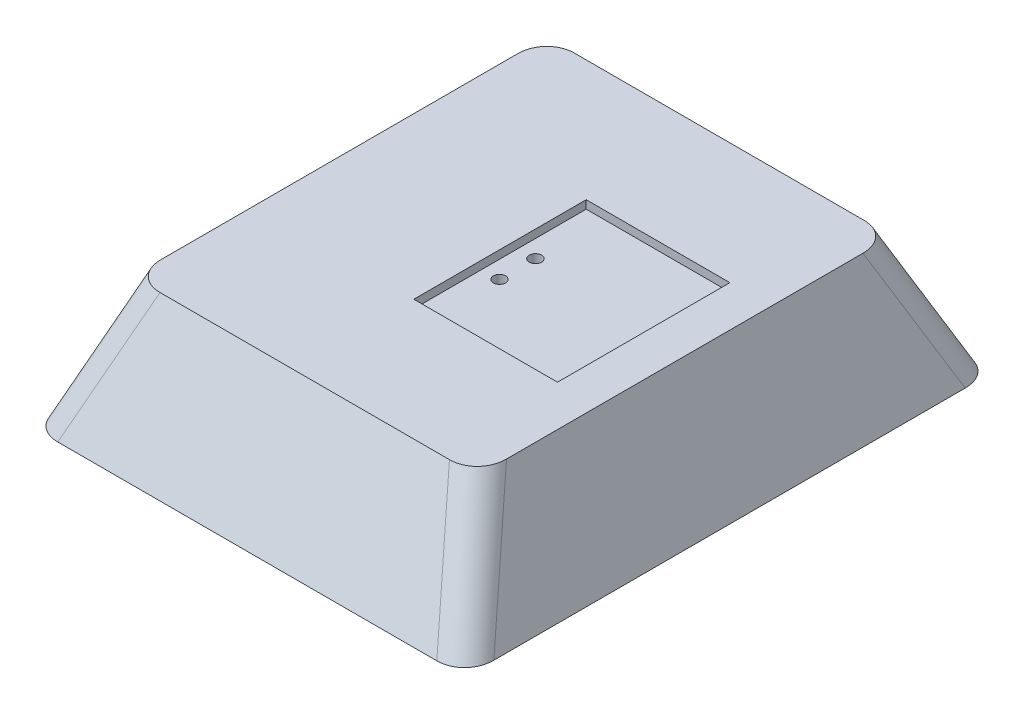
ISO-10303-21;
HEADER;
FILE_DESCRIPTION(('STEP AP214'),'2;1');
FILE_NAME('part.step','',(''),(''),'','','');
FILE_SCHEMA(('AUTOMOTIVE_DESIGN { 1 0 10303 214 1 1 1 1 }'));
ENDSEC;
DATA;
#1=APPLICATION_CONTEXT('core data for automotive mechanical design processes');
#2=APPLICATION_PROTOCOL_DEFINITION('international standard','automotive_design',2000,#1);
#3=PRODUCT_CONTEXT('',#1,'mechanical');
#4=PRODUCT('Part','Part','',(#3));
#5=PRODUCT_RELATED_PRODUCT_CATEGORY('part','',(#4));
#6=PRODUCT_DEFINITION_FORMATION('','',#4);
#7=PRODUCT_DEFINITION_CONTEXT('part definition',#1,'design');
#8=PRODUCT_DEFINITION('design','',#6,#7);
#9=PRODUCT_DEFINITION_SHAPE('','',#8);
#10=(LENGTH_UNIT() NAMED_UNIT(*) SI_UNIT(.MILLI.,.METRE.));
#11=(NAMED_UNIT(*) PLANE_ANGLE_UNIT() SI_UNIT($,.RADIAN.));
#12=(NAMED_UNIT(*) SI_UNIT($,.STERADIAN.) SOLID_ANGLE_UNIT());
#13=UNCERTAINTY_MEASURE_WITH_UNIT(LENGTH_MEASURE(1.E-05),#10,'distance_accuracy_value','');
#14=(GEOMETRIC_REPRESENTATION_CONTEXT(3) GLOBAL_UNCERTAINTY_ASSIGNED_CONTEXT((#13)) GLOBAL_UNIT_ASSIGNED_CONTEXT((#10,
#11,#12)) REPRESENTATION_CONTEXT('',''));
#15=CARTESIAN_POINT('',(0.,0.,0.));
#16=DIRECTION('',(0.,0.,1.));
#17=DIRECTION('',(1.,0.,0.));
#18=AXIS2_PLACEMENT_3D('',#15,#16,#17);
#19=CARTESIAN_POINT('',(-48.,4.,77.));
#20=DIRECTION('',(-1.,0.,0.));
#21=DIRECTION('',(0.,0.,1.));
#22=AXIS2_PLACEMENT_3D('',#19,#20,#21);
#23=PLANE('',#22);
#24=DIRECTION('',(0.,1.,0.));
#25=VECTOR('',#24,1.);
#26=CARTESIAN_POINT('',(-48.,4.,0.));
#27=LINE('',#26,#25);
#28=CARTESIAN_POINT('',(-48.,-3.5,0.));
#29=VERTEX_POINT('',#28);
#30=CARTESIAN_POINT('',(-48.,4.,0.));
#31=VERTEX_POINT('',#30);
#32=EDGE_CURVE('E249',#29,#31,#27,.T.);
#33=ORIENTED_EDGE('',*,*,#32,.T.);
#34=DIRECTION('',(0.,0.,-1.));
#35=VECTOR('',#34,1.);
#36=CARTESIAN_POINT('',(-48.,4.,77.));
#37=LINE('',#36,#35);
#38=CARTESIAN_POINT('',(-48.,4.,77.));
#39=VERTEX_POINT('',#38);
#40=EDGE_CURVE('E352',#39,#31,#37,.T.);
#41=ORIENTED_EDGE('',*,*,#40,.F.);
#42=DIRECTION('',(0.,1.,0.));
#43=VECTOR('',#42,1.);
#44=CARTESIAN_POINT('',(-48.,4.,77.));
#45=LINE('',#44,#43);
#46=CARTESIAN_POINT('',(-48.,-3.5,77.));
#47=VERTEX_POINT('',#46);
#48=EDGE_CURVE('E253',#47,#39,#45,.T.);
#49=ORIENTED_EDGE('',*,*,#48,.F.);
#50=DIRECTION('',(0.,0.,-1.));
#51=VECTOR('',#50,1.);
#52=CARTESIAN_POINT('',(-48.,-3.5,77.));
#53=LINE('',#52,#51);
#54=EDGE_CURVE('E282',#47,#29,#53,.T.);
#55=ORIENTED_EDGE('',*,*,#54,.T.);
#56=EDGE_LOOP('',(#33,#41,#49,#55));
#57=FACE_BOUND('',#56,.T.);
#58=ADVANCED_FACE('F41',(#57),#23,.F.);
#59=CARTESIAN_POINT('',(-38.,4.,77.));
#60=DIRECTION('',(0.,1.,0.));
#61=DIRECTION('',(0.,0.,1.));
#62=AXIS2_PLACEMENT_3D('',#59,#60,#61);
#63=PLANE('',#62);
#64=DIRECTION('',(1.,0.,0.));
#65=VECTOR('',#64,1.);
#66=CARTESIAN_POINT('',(-38.,4.,0.));
#67=LINE('',#66,#65);
#68=CARTESIAN_POINT('',(-38.,4.,0.));
#69=VERTEX_POINT('',#68);
#70=EDGE_CURVE('E286',#31,#69,#67,.T.);
#71=ORIENTED_EDGE('',*,*,#70,.T.);
#72=DIRECTION('',(0.,0.,-1.));
#73=VECTOR('',#72,1.);
#74=CARTESIAN_POINT('',(-38.,4.,77.));
#75=LINE('',#74,#73);
#76=CARTESIAN_POINT('',(-38.,4.,77.));
#77=VERTEX_POINT('',#76);
#78=EDGE_CURVE('E348',#77,#69,#75,.T.);
#79=ORIENTED_EDGE('',*,*,#78,.F.);
#80=DIRECTION('',(1.,0.,0.));
#81=VECTOR('',#80,1.);
#82=CARTESIAN_POINT('',(-38.,4.,77.));
#83=LINE('',#82,#81);
#84=EDGE_CURVE('E257',#39,#77,#83,.T.);
#85=ORIENTED_EDGE('',*,*,#84,.F.);
#86=ORIENTED_EDGE('',*,*,#40,.T.);
#87=EDGE_LOOP('',(#71,#79,#85,#86));
#88=FACE_BOUND('',#87,.T.);
#89=ADVANCED_FACE('F471',(#88),#63,.F.);
#90=CARTESIAN_POINT('',(-38.,21.5,77.));
#91=DIRECTION('',(-1.,0.,0.));
#92=DIRECTION('',(0.,-1.,0.));
#93=AXIS2_PLACEMENT_3D('',#90,#91,#92);
#94=PLANE('',#93);
#95=DIRECTION('',(0.,1.,0.));
#96=VECTOR('',#95,1.);
#97=CARTESIAN_POINT('',(-38.,21.5,0.));
#98=LINE('',#97,#96);
#99=CARTESIAN_POINT('',(-38.,21.5,0.));
#100=VERTEX_POINT('',#99);
#101=EDGE_CURVE('E290',#69,#100,#98,.T.);
#102=ORIENTED_EDGE('',*,*,#101,.T.);
#103=DIRECTION('',(0.,0.,-1.));
#104=VECTOR('',#103,1.);
#105=CARTESIAN_POINT('',(-38.,21.5,77.));
#106=LINE('',#105,#104);
#107=CARTESIAN_POINT('',(-38.,21.5,77.));
#108=VERTEX_POINT('',#107);
#109=EDGE_CURVE('E344',#108,#100,#106,.T.);
#110=ORIENTED_EDGE('',*,*,#109,.F.);
#111=DIRECTION('',(0.,1.,0.));
#112=VECTOR('',#111,1.);
#113=CARTESIAN_POINT('',(-38.,21.5,77.));
#114=LINE('',#113,#112);
#115=EDGE_CURVE('E262',#77,#108,#114,.T.);
#116=ORIENTED_EDGE('',*,*,#115,.F.);
#117=ORIENTED_EDGE('',*,*,#78,.T.);
#118=EDGE_LOOP('',(#102,#110,#116,#117));
#119=FACE_BOUND('',#118,.T.);
#120=ADVANCED_FACE('F477',(#119),#94,.F.);
#121=CARTESIAN_POINT('',(38.,21.5,77.));
#122=DIRECTION('',(0.,1.,0.));
#123=DIRECTION('',(-1.,0.,0.));
#124=AXIS2_PLACEMENT_3D('',#121,#122,#123);
#125=PLANE('',#124);
#126=CARTESIAN_POINT('',(1.33089297201378,21.5,34.125));
#127=DIRECTION('',(0.,1.,0.));
#128=DIRECTION('',(-1.,0.,0.));
#129=AXIS2_PLACEMENT_3D('',#126,#127,#128);
#130=CIRCLE('',#129,1.5);
#131=CARTESIAN_POINT('',(-0.169107027986218,21.5,34.125));
#132=VERTEX_POINT('',#131);
#133=EDGE_CURVE('E215',#132,#132,#130,.T.);
#134=ORIENTED_EDGE('',*,*,#133,.T.);
#135=EDGE_LOOP('',(#134));
#136=FACE_BOUND('',#135,.T.);
#137=CARTESIAN_POINT('',(1.33089297201378,21.5,42.875));
#138=DIRECTION('',(0.,1.,0.));
#139=DIRECTION('',(-1.,0.,0.));
#140=AXIS2_PLACEMENT_3D('',#137,#138,#139);
#141=CIRCLE('',#140,1.5);
#142=CARTESIAN_POINT('',(-0.169107027986218,21.5,42.875));
#143=VERTEX_POINT('',#142);
#144=EDGE_CURVE('E445',#143,#143,#141,.T.);
#145=ORIENTED_EDGE('',*,*,#144,.T.);
#146=EDGE_LOOP('',(#145));
#147=FACE_BOUND('',#146,.T.);
#148=DIRECTION('',(1.,0.,0.));
#149=VECTOR('',#148,1.);
#150=CARTESIAN_POINT('',(38.,21.5,0.));
#151=LINE('',#150,#149);
#152=CARTESIAN_POINT('',(38.,21.5,0.));
#153=VERTEX_POINT('',#152);
#154=EDGE_CURVE('E294',#100,#153,#151,.T.);
#155=ORIENTED_EDGE('',*,*,#154,.T.);
#156=DIRECTION('',(0.,0.,-1.));
#157=VECTOR('',#156,1.);
#158=CARTESIAN_POINT('',(38.,21.5,77.));
#159=LINE('',#158,#157);
#160=CARTESIAN_POINT('',(38.,21.5,77.));
#161=VERTEX_POINT('',#160);
#162=EDGE_CURVE('E340',#161,#153,#159,.T.);
#163=ORIENTED_EDGE('',*,*,#162,.F.);
#164=DIRECTION('',(1.,0.,0.));
#165=VECTOR('',#164,1.);
#166=CARTESIAN_POINT('',(38.,21.5,77.));
#167=LINE('',#166,#165);
#168=EDGE_CURVE('E266',#108,#161,#167,.T.);
#169=ORIENTED_EDGE('',*,*,#168,.F.);
#170=ORIENTED_EDGE('',*,*,#109,.T.);
#171=EDGE_LOOP('',(#155,#163,#169,#170));
#172=FACE_BOUND('',#171,.T.);
#173=ADVANCED_FACE('F456',(#136,#147,#172),#125,.F.);
#174=CARTESIAN_POINT('',(38.,4.,77.));
#175=DIRECTION('',(1.,0.,0.));
#176=DIRECTION('',(0.,0.,-1.));
#177=AXIS2_PLACEMENT_3D('',#174,#175,#176);
#178=PLANE('',#177);
#179=DIRECTION('',(0.,-1.,0.));
#180=VECTOR('',#179,1.);
#181=CARTESIAN_POINT('',(38.,4.,0.));
#182=LINE('',#181,#180);
#183=CARTESIAN_POINT('',(38.,4.,0.));
#184=VERTEX_POINT('',#183);
#185=EDGE_CURVE('E298',#153,#184,#182,.T.);
#186=ORIENTED_EDGE('',*,*,#185,.T.);
#187=DIRECTION('',(0.,0.,-1.));
#188=VECTOR('',#187,1.);
#189=CARTESIAN_POINT('',(38.,4.,77.));
#190=LINE('',#189,#188);
#191=CARTESIAN_POINT('',(38.,4.,77.));
#192=VERTEX_POINT('',#191);
#193=EDGE_CURVE('E336',#192,#184,#190,.T.);
#194=ORIENTED_EDGE('',*,*,#193,.F.);
#195=DIRECTION('',(0.,-1.,0.));
#196=VECTOR('',#195,1.);
#197=CARTESIAN_POINT('',(38.,4.,77.));
#198=LINE('',#197,#196);
#199=EDGE_CURVE('E270',#161,#192,#198,.T.);
#200=ORIENTED_EDGE('',*,*,#199,.F.);
#201=ORIENTED_EDGE('',*,*,#162,.T.);
#202=EDGE_LOOP('',(#186,#194,#200,#201));
#203=FACE_BOUND('',#202,.T.);
#204=ADVANCED_FACE('F598',(#203),#178,.F.);
#205=CARTESIAN_POINT('',(48.,4.,77.));
#206=DIRECTION('',(0.,1.,0.));
#207=DIRECTION('',(0.,0.,1.));
#208=AXIS2_PLACEMENT_3D('',#205,#206,#207);
#209=PLANE('',#208);
#210=DIRECTION('',(1.,0.,0.));
#211=VECTOR('',#210,1.);
#212=CARTESIAN_POINT('',(48.,4.,0.));
#213=LINE('',#212,#211);
#214=CARTESIAN_POINT('',(48.,4.,0.));
#215=VERTEX_POINT('',#214);
#216=EDGE_CURVE('E302',#184,#215,#213,.T.);
#217=ORIENTED_EDGE('',*,*,#216,.T.);
#218=DIRECTION('',(0.,0.,-1.));
#219=VECTOR('',#218,1.);
#220=CARTESIAN_POINT('',(48.,4.,77.));
#221=LINE('',#220,#219);
#222=CARTESIAN_POINT('',(48.,4.,77.));
#223=VERTEX_POINT('',#222);
#224=EDGE_CURVE('E332',#223,#215,#221,.T.);
#225=ORIENTED_EDGE('',*,*,#224,.F.);
#226=DIRECTION('',(1.,0.,0.));
#227=VECTOR('',#226,1.);
#228=CARTESIAN_POINT('',(48.,4.,77.));
#229=LINE('',#228,#227);
#230=EDGE_CURVE('E274',#192,#223,#229,.T.);
#231=ORIENTED_EDGE('',*,*,#230,.F.);
#232=ORIENTED_EDGE('',*,*,#193,.T.);
#233=EDGE_LOOP('',(#217,#225,#231,#232));
#234=FACE_BOUND('',#233,.T.);
#235=ADVANCED_FACE('F655',(#234),#209,.F.);
#236=CARTESIAN_POINT('',(48.,-3.5,77.));
#237=DIRECTION('',(1.,0.,0.));
#238=DIRECTION('',(0.,0.,-1.));
#239=AXIS2_PLACEMENT_3D('',#236,#237,#238);
#240=PLANE('',#239);
#241=DIRECTION('',(0.,-1.,0.));
#242=VECTOR('',#241,1.);
#243=CARTESIAN_POINT('',(48.,-3.5,0.));
#244=LINE('',#243,#242);
#245=CARTESIAN_POINT('',(48.,-3.5,0.));
#246=VERTEX_POINT('',#245);
#247=EDGE_CURVE('E258',#215,#246,#244,.T.);
#248=ORIENTED_EDGE('',*,*,#247,.T.);
#249=DIRECTION('',(0.,0.,-1.));
#250=VECTOR('',#249,1.);
#251=CARTESIAN_POINT('',(48.,-3.5,77.));
#252=LINE('',#251,#250);
#253=CARTESIAN_POINT('',(48.,-3.5,77.));
#254=VERTEX_POINT('',#253);
#255=EDGE_CURVE('E328',#254,#246,#252,.T.);
#256=ORIENTED_EDGE('',*,*,#255,.F.);
#257=DIRECTION('',(0.,-1.,0.));
#258=VECTOR('',#257,1.);
#259=CARTESIAN_POINT('',(48.,-3.5,77.));
#260=LINE('',#259,#258);
#261=EDGE_CURVE('E278',#223,#254,#260,.T.);
#262=ORIENTED_EDGE('',*,*,#261,.F.);
#263=ORIENTED_EDGE('',*,*,#224,.T.);
#264=EDGE_LOOP('',(#248,#256,#262,#263));
#265=FACE_BOUND('',#264,.T.);
#266=ADVANCED_FACE('F565',(#265),#240,.F.);
#267=CARTESIAN_POINT('',(42.0808929720138,26.5,77.));
#268=DIRECTION('',(-0.939692620785907,-0.342020143325673,0.));
#269=DIRECTION('',(0.342020143325673,-0.939692620785907,0.));
#270=AXIS2_PLACEMENT_3D('',#267,#268,#269);
#271=PLANE('',#270);
#272=DIRECTION('',(0.,0.,-1.));
#273=VECTOR('',#272,1.);
#274=CARTESIAN_POINT('',(53.,-3.5,77.));
#275=LINE('',#274,#273);
#276=CARTESIAN_POINT('',(53.,-3.5,95.9100449430017));
#277=VERTEX_POINT('',#276);
#278=CARTESIAN_POINT('',(53.,-3.5,-18.9100449430017));
#279=VERTEX_POINT('',#278);
#280=EDGE_CURVE('E324',#277,#279,#275,.T.);
#281=ORIENTED_EDGE('',*,*,#280,.T.);
#282=DIRECTION('',(-0.313265312482048,0.860689372342812,0.401346045616076));
#283=VECTOR('',#282,1.);
#284=CARTESIAN_POINT('',(42.970943263228,24.0546069227099,-6.06112071749113));
#285=LINE('',#284,#283);
#286=CARTESIAN_POINT('',(42.0808929720138,26.5,-4.92081519835155));
#287=VERTEX_POINT('',#286);
#288=EDGE_CURVE('E11',#279,#287,#285,.T.);
#289=ORIENTED_EDGE('',*,*,#288,.T.);
#290=DIRECTION('',(0.,0.,-1.));
#291=VECTOR('',#290,1.);
#292=CARTESIAN_POINT('',(42.0808929720138,26.5,77.));
#293=LINE('',#292,#291);
#294=CARTESIAN_POINT('',(42.0808929720138,26.5,81.9208151983515));
#295=VERTEX_POINT('',#294);
#296=EDGE_CURVE('E320',#295,#287,#293,.T.);
#297=ORIENTED_EDGE('',*,*,#296,.F.);
#298=DIRECTION('',(-0.313265312482048,0.860689372342812,-0.401346045616076));
#299=VECTOR('',#298,1.);
#300=CARTESIAN_POINT('',(41.4622097305078,28.1998182358328,81.1281769375112));
#301=LINE('',#300,#299);
#302=EDGE_CURVE('E50',#295,#277,#301,.F.);
#303=ORIENTED_EDGE('',*,*,#302,.T.);
#304=EDGE_LOOP('',(#281,#289,#297,#303));
#305=FACE_BOUND('',#304,.T.);
#306=ADVANCED_FACE('F402',(#305),#271,.F.);
#307=CARTESIAN_POINT('',(-42.0808929720138,26.5,77.));
#308=DIRECTION('',(0.,-1.,0.));
#309=DIRECTION('',(0.,0.,-1.));
#310=AXIS2_PLACEMENT_3D('',#307,#308,#309);
#311=PLANE('',#310);
#312=DIRECTION('',(-1.,0.,0.));
#313=VECTOR('',#312,1.);
#314=CARTESIAN_POINT('',(-2.91910702798621,26.5,17.5));
#315=LINE('',#314,#313);
#316=CARTESIAN_POINT('',(32.0808929720138,26.5,17.5));
#317=VERTEX_POINT('',#316);
#318=CARTESIAN_POINT('',(-2.91910702798621,26.5,17.5));
#319=VERTEX_POINT('',#318);
#320=EDGE_CURVE('E224',#317,#319,#315,.T.);
#321=ORIENTED_EDGE('',*,*,#320,.F.);
#322=DIRECTION('',(0.,0.,-1.));
#323=VECTOR('',#322,1.);
#324=CARTESIAN_POINT('',(32.0808929720138,26.5,59.5));
#325=LINE('',#324,#323);
#326=CARTESIAN_POINT('',(32.0808929720138,26.5,59.5));
#327=VERTEX_POINT('',#326);
#328=EDGE_CURVE('E188',#327,#317,#325,.T.);
#329=ORIENTED_EDGE('',*,*,#328,.F.);
#330=DIRECTION('',(1.,0.,0.));
#331=VECTOR('',#330,1.);
#332=CARTESIAN_POINT('',(-2.91910702798621,26.5,59.5));
#333=LINE('',#332,#331);
#334=CARTESIAN_POINT('',(-2.91910702798621,26.5,59.5));
#335=VERTEX_POINT('',#334);
#336=EDGE_CURVE('E208',#335,#327,#333,.T.);
#337=ORIENTED_EDGE('',*,*,#336,.F.);
#338=DIRECTION('',(0.,0.,1.));
#339=VECTOR('',#338,1.);
#340=CARTESIAN_POINT('',(-2.91910702798621,26.5,59.5));
#341=LINE('',#340,#339);
#342=EDGE_CURVE('E212',#319,#335,#341,.T.);
#343=ORIENTED_EDGE('',*,*,#342,.F.);
#344=EDGE_LOOP('',(#321,#329,#337,#343));
#345=FACE_BOUND('',#344,.T.);
#346=DIRECTION('',(-1.,0.,0.));
#347=VECTOR('',#346,1.);
#348=CARTESIAN_POINT('',(-42.0808929720138,26.5,-12.));
#349=LINE('',#348,#347);
#350=CARTESIAN_POINT('',(35.2532131864265,26.5,-12.));
#351=VERTEX_POINT('',#350);
#352=CARTESIAN_POINT('',(-35.2532131864265,26.5,-12.));
#353=VERTEX_POINT('',#352);
#354=EDGE_CURVE('E239',#351,#353,#349,.T.);
#355=ORIENTED_EDGE('',*,*,#354,.T.);
#356=CARTESIAN_POINT('',(-34.0995596784444,26.5,-3.7246656077813));
#357=DIRECTION('',(0.,-1.,0.));
#358=DIRECTION('',(-0.615294801158759,0.,-0.788297093529466));
#359=AXIS2_PLACEMENT_3D('',#356,#357,#358);
#360=ELLIPSE('',#359,8.71394517116537,7.5);
#361=CARTESIAN_POINT('',(-42.0808929720138,26.5,-4.92081519835154));
#362=VERTEX_POINT('',#361);
#363=EDGE_CURVE('E372',#353,#362,#360,.F.);
#364=ORIENTED_EDGE('',*,*,#363,.T.);
#365=DIRECTION('',(0.,0.,-1.));
#366=VECTOR('',#365,1.);
#367=CARTESIAN_POINT('',(-42.0808929720138,26.5,77.));
#368=LINE('',#367,#366);
#369=CARTESIAN_POINT('',(-42.0808929720138,26.5,81.9208151983515));
#370=VERTEX_POINT('',#369);
#371=EDGE_CURVE('E316',#370,#362,#368,.T.);
#372=ORIENTED_EDGE('',*,*,#371,.F.);
#373=CARTESIAN_POINT('',(-34.0995596784444,26.5,80.7246656077813));
#374=DIRECTION('',(0.,-1.,0.));
#375=DIRECTION('',(0.615294801158759,0.,-0.788297093529466));
#376=AXIS2_PLACEMENT_3D('',#373,#374,#375);
#377=ELLIPSE('',#376,8.71394517116537,7.5);
#378=CARTESIAN_POINT('',(-35.2532131864265,26.5,89.));
#379=VERTEX_POINT('',#378);
#380=EDGE_CURVE('E369',#370,#379,#377,.F.);
#381=ORIENTED_EDGE('',*,*,#380,.T.);
#382=DIRECTION('',(-1.,0.,0.));
#383=VECTOR('',#382,1.);
#384=CARTESIAN_POINT('',(-42.0808929720138,26.5,89.));
#385=LINE('',#384,#383);
#386=CARTESIAN_POINT('',(35.2532131864265,26.5,89.));
#387=VERTEX_POINT('',#386);
#388=EDGE_CURVE('E246',#387,#379,#385,.T.);
#389=ORIENTED_EDGE('',*,*,#388,.F.);
#390=CARTESIAN_POINT('',(34.0995596784444,26.5,80.7246656077813));
#391=DIRECTION('',(0.,-1.,0.));
#392=DIRECTION('',(-0.61529480115876,0.,-0.788297093529465));
#393=AXIS2_PLACEMENT_3D('',#390,#391,#392);
#394=ELLIPSE('',#393,8.71394517116537,7.5);
#395=EDGE_CURVE('E363',#387,#295,#394,.F.);
#396=ORIENTED_EDGE('',*,*,#395,.T.);
#397=ORIENTED_EDGE('',*,*,#296,.T.);
#398=CARTESIAN_POINT('',(34.0995596784444,26.5,-3.7246656077813));
#399=DIRECTION('',(0.,-1.,0.));
#400=DIRECTION('',(0.61529480115876,0.,-0.788297093529465));
#401=AXIS2_PLACEMENT_3D('',#398,#399,#400);
#402=ELLIPSE('',#401,8.71394517116537,7.5);
#403=EDGE_CURVE('E366',#287,#351,#402,.F.);
#404=ORIENTED_EDGE('',*,*,#403,.T.);
#405=EDGE_LOOP('',(#355,#364,#372,#381,#389,#396,#397,#404));
#406=FACE_BOUND('',#405,.T.);
#407=ADVANCED_FACE('F413',(#345,#406),#311,.F.);
#408=CARTESIAN_POINT('',(-53.,-3.5,77.));
#409=DIRECTION('',(0.939692620785907,-0.342020143325672,0.));
#410=DIRECTION('',(0.342020143325672,0.939692620785907,0.));
#411=AXIS2_PLACEMENT_3D('',#408,#409,#410);
#412=PLANE('',#411);
#413=ORIENTED_EDGE('',*,*,#371,.T.);
#414=DIRECTION('',(0.313265312482048,0.860689372342812,0.401346045616076));
#415=VECTOR('',#414,1.);
#416=CARTESIAN_POINT('',(-53.8900502912142,-5.94539307729004,-20.0503504621412));
#417=LINE('',#416,#415);
#418=CARTESIAN_POINT('',(-53.,-3.5,-18.9100449430017));
#419=VERTEX_POINT('',#418);
#420=EDGE_CURVE('E379',#362,#419,#417,.F.);
#421=ORIENTED_EDGE('',*,*,#420,.T.);
#422=DIRECTION('',(0.,0.,-1.));
#423=VECTOR('',#422,1.);
#424=CARTESIAN_POINT('',(-53.,-3.5,77.));
#425=LINE('',#424,#423);
#426=CARTESIAN_POINT('',(-53.,-3.5,95.9100449430016));
#427=VERTEX_POINT('',#426);
#428=EDGE_CURVE('E312',#427,#419,#425,.T.);
#429=ORIENTED_EDGE('',*,*,#428,.F.);
#430=DIRECTION('',(0.313265312482048,0.860689372342812,-0.401346045616076));
#431=VECTOR('',#430,1.);
#432=CARTESIAN_POINT('',(-50.6224817574372,3.03217768578265,92.8640404636919));
#433=LINE('',#432,#431);
#434=EDGE_CURVE('E375',#427,#370,#433,.T.);
#435=ORIENTED_EDGE('',*,*,#434,.T.);
#436=EDGE_LOOP('',(#413,#421,#429,#435));
#437=FACE_BOUND('',#436,.T.);
#438=ADVANCED_FACE('F421',(#437),#412,.F.);
#439=CARTESIAN_POINT('',(-48.,-3.5,77.));
#440=DIRECTION('',(0.,1.,0.));
#441=DIRECTION('',(0.,0.,1.));
#442=AXIS2_PLACEMENT_3D('',#439,#440,#441);
#443=PLANE('',#442);
#444=DIRECTION('',(1.,0.,0.));
#445=VECTOR('',#444,1.);
#446=CARTESIAN_POINT('',(53.,-3.5,0.));
#447=LINE('',#446,#445);
#448=EDGE_CURVE('E233',#29,#246,#447,.T.);
#449=ORIENTED_EDGE('',*,*,#448,.F.);
#450=ORIENTED_EDGE('',*,*,#54,.F.);
#451=DIRECTION('',(1.,0.,0.));
#452=VECTOR('',#451,1.);
#453=CARTESIAN_POINT('',(53.,-3.5,77.));
#454=LINE('',#453,#452);
#455=EDGE_CURVE('E243',#47,#254,#454,.T.);
#456=ORIENTED_EDGE('',*,*,#455,.T.);
#457=ORIENTED_EDGE('',*,*,#255,.T.);
#458=EDGE_LOOP('',(#449,#450,#456,#457));
#459=FACE_BOUND('',#458,.T.);
#460=ORIENTED_EDGE('',*,*,#428,.T.);
#461=CARTESIAN_POINT('',(-45.0186667064306,-3.5,-17.7138953524314));
#462=DIRECTION('',(0.,1.,0.));
#463=DIRECTION('',(-0.615294801158759,0.,-0.788297093529466));
#464=AXIS2_PLACEMENT_3D('',#461,#462,#463);
#465=ELLIPSE('',#464,8.71394517116537,7.5);
#466=CARTESIAN_POINT('',(-46.1723202144126,-3.5,-25.9892297446501));
#467=VERTEX_POINT('',#466);
#468=EDGE_CURVE('E390',#419,#467,#465,.F.);
#469=ORIENTED_EDGE('',*,*,#468,.T.);
#470=DIRECTION('',(-1.,0.,0.));
#471=VECTOR('',#470,1.);
#472=CARTESIAN_POINT('',(81.7039691104535,-3.5,-25.9892297446501));
#473=LINE('',#472,#471);
#474=CARTESIAN_POINT('',(46.1723202144127,-3.5,-25.9892297446501));
#475=VERTEX_POINT('',#474);
#476=EDGE_CURVE('E432',#475,#467,#473,.T.);
#477=ORIENTED_EDGE('',*,*,#476,.F.);
#478=CARTESIAN_POINT('',(45.0186667064307,-3.5,-17.7138953524314));
#479=DIRECTION('',(0.,1.,0.));
#480=DIRECTION('',(0.61529480115876,0.,-0.788297093529465));
#481=AXIS2_PLACEMENT_3D('',#478,#479,#480);
#482=ELLIPSE('',#481,8.71394517116537,7.5);
#483=EDGE_CURVE('E384',#475,#279,#482,.F.);
#484=ORIENTED_EDGE('',*,*,#483,.T.);
#485=ORIENTED_EDGE('',*,*,#280,.F.);
#486=CARTESIAN_POINT('',(45.0186667064307,-3.5,94.7138953524314));
#487=DIRECTION('',(0.,1.,0.));
#488=DIRECTION('',(-0.61529480115876,0.,-0.788297093529465));
#489=AXIS2_PLACEMENT_3D('',#486,#487,#488);
#490=ELLIPSE('',#489,8.71394517116537,7.5);
#491=CARTESIAN_POINT('',(46.1723202144127,-3.5,102.98922974465));
#492=VERTEX_POINT('',#491);
#493=EDGE_CURVE('E64',#277,#492,#490,.F.);
#494=ORIENTED_EDGE('',*,*,#493,.T.);
#495=DIRECTION('',(-1.,0.,0.));
#496=VECTOR('',#495,1.);
#497=CARTESIAN_POINT('',(81.7039691104535,-3.5,102.98922974465));
#498=LINE('',#497,#496);
#499=CARTESIAN_POINT('',(-46.1723202144126,-3.5,102.98922974465));
#500=VERTEX_POINT('',#499);
#501=EDGE_CURVE('E411',#492,#500,#498,.T.);
#502=ORIENTED_EDGE('',*,*,#501,.T.);
#503=CARTESIAN_POINT('',(-45.0186667064306,-3.5,94.7138953524314));
#504=DIRECTION('',(0.,1.,0.));
#505=DIRECTION('',(0.615294801158759,0.,-0.788297093529466));
#506=AXIS2_PLACEMENT_3D('',#503,#504,#505);
#507=ELLIPSE('',#506,8.71394517116537,7.5);
#508=EDGE_CURVE('E387',#500,#427,#507,.F.);
#509=ORIENTED_EDGE('',*,*,#508,.T.);
#510=EDGE_LOOP('',(#460,#469,#477,#484,#485,#494,#502,#509));
#511=FACE_BOUND('',#510,.T.);
#512=ADVANCED_FACE('F405',(#459,#511),#443,.F.);
#513=CARTESIAN_POINT('',(0.,0.,77.));
#514=DIRECTION('',(0.,0.,-1.));
#515=DIRECTION('',(-1.,0.,0.));
#516=AXIS2_PLACEMENT_3D('',#513,#514,#515);
#517=PLANE('',#516);
#518=ORIENTED_EDGE('',*,*,#455,.F.);
#519=ORIENTED_EDGE('',*,*,#48,.T.);
#520=ORIENTED_EDGE('',*,*,#84,.T.);
#521=ORIENTED_EDGE('',*,*,#115,.T.);
#522=ORIENTED_EDGE('',*,*,#168,.T.);
#523=ORIENTED_EDGE('',*,*,#199,.T.);
#524=ORIENTED_EDGE('',*,*,#230,.T.);
#525=ORIENTED_EDGE('',*,*,#261,.T.);
#526=EDGE_LOOP('',(#518,#519,#520,#521,#522,#523,#524,#525));
#527=FACE_BOUND('',#526,.T.);
#528=ADVANCED_FACE('F534',(#527),#517,.T.);
#529=CARTESIAN_POINT('',(0.,0.,0.));
#530=DIRECTION('',(0.,0.,1.));
#531=DIRECTION('',(-1.,0.,0.));
#532=AXIS2_PLACEMENT_3D('',#529,#530,#531);
#533=PLANE('',#532);
#534=ORIENTED_EDGE('',*,*,#32,.F.);
#535=ORIENTED_EDGE('',*,*,#448,.T.);
#536=ORIENTED_EDGE('',*,*,#247,.F.);
#537=ORIENTED_EDGE('',*,*,#216,.F.);
#538=ORIENTED_EDGE('',*,*,#185,.F.);
#539=ORIENTED_EDGE('',*,*,#154,.F.);
#540=ORIENTED_EDGE('',*,*,#101,.F.);
#541=ORIENTED_EDGE('',*,*,#70,.F.);
#542=EDGE_LOOP('',(#534,#535,#536,#537,#538,#539,#540,#541));
#543=FACE_BOUND('',#542,.T.);
#544=ADVANCED_FACE('F637',(#543),#533,.T.);
#545=CARTESIAN_POINT('',(32.0808929720138,24.5,59.5));
#546=DIRECTION('',(1.,0.,0.));
#547=DIRECTION('',(0.,1.,0.));
#548=AXIS2_PLACEMENT_3D('',#545,#546,#547);
#549=PLANE('',#548);
#550=ORIENTED_EDGE('',*,*,#328,.T.);
#551=DIRECTION('',(0.,1.,0.));
#552=VECTOR('',#551,1.);
#553=CARTESIAN_POINT('',(32.0808929720138,24.5,17.5));
#554=LINE('',#553,#552);
#555=CARTESIAN_POINT('',(32.0808929720138,24.5,17.5));
#556=VERTEX_POINT('',#555);
#557=EDGE_CURVE('E181',#556,#317,#554,.T.);
#558=ORIENTED_EDGE('',*,*,#557,.F.);
#559=DIRECTION('',(0.,0.,-1.));
#560=VECTOR('',#559,1.);
#561=CARTESIAN_POINT('',(32.0808929720138,24.5,59.5));
#562=LINE('',#561,#560);
#563=CARTESIAN_POINT('',(32.0808929720138,24.5,59.5));
#564=VERTEX_POINT('',#563);
#565=EDGE_CURVE('E185',#564,#556,#562,.T.);
#566=ORIENTED_EDGE('',*,*,#565,.F.);
#567=DIRECTION('',(0.,1.,0.));
#568=VECTOR('',#567,1.);
#569=CARTESIAN_POINT('',(32.0808929720138,24.5,59.5));
#570=LINE('',#569,#568);
#571=EDGE_CURVE('E230',#564,#327,#570,.T.);
#572=ORIENTED_EDGE('',*,*,#571,.T.);
#573=EDGE_LOOP('',(#550,#558,#566,#572));
#574=FACE_BOUND('',#573,.T.);
#575=ADVANCED_FACE('F183',(#574),#549,.F.);
#576=CARTESIAN_POINT('',(-2.91910702798621,24.5,59.5));
#577=DIRECTION('',(0.,0.,1.));
#578=DIRECTION('',(1.,0.,0.));
#579=AXIS2_PLACEMENT_3D('',#576,#577,#578);
#580=PLANE('',#579);
#581=ORIENTED_EDGE('',*,*,#336,.T.);
#582=ORIENTED_EDGE('',*,*,#571,.F.);
#583=DIRECTION('',(1.,0.,0.));
#584=VECTOR('',#583,1.);
#585=CARTESIAN_POINT('',(-2.91910702798621,24.5,59.5));
#586=LINE('',#585,#584);
#587=CARTESIAN_POINT('',(-2.91910702798621,24.5,59.5));
#588=VERTEX_POINT('',#587);
#589=EDGE_CURVE('E194',#588,#564,#586,.T.);
#590=ORIENTED_EDGE('',*,*,#589,.F.);
#591=DIRECTION('',(0.,1.,0.));
#592=VECTOR('',#591,1.);
#593=CARTESIAN_POINT('',(-2.91910702798621,24.5,59.5));
#594=LINE('',#593,#592);
#595=EDGE_CURVE('E234',#588,#335,#594,.T.);
#596=ORIENTED_EDGE('',*,*,#595,.T.);
#597=EDGE_LOOP('',(#581,#582,#590,#596));
#598=FACE_BOUND('',#597,.T.);
#599=ADVANCED_FACE('F618',(#598),#580,.F.);
#600=CARTESIAN_POINT('',(-2.91910702798621,24.5,59.5));
#601=DIRECTION('',(-1.,0.,0.));
#602=DIRECTION('',(0.,-1.,0.));
#603=AXIS2_PLACEMENT_3D('',#600,#601,#602);
#604=PLANE('',#603);
#605=ORIENTED_EDGE('',*,*,#342,.T.);
#606=ORIENTED_EDGE('',*,*,#595,.F.);
#607=DIRECTION('',(0.,0.,1.));
#608=VECTOR('',#607,1.);
#609=CARTESIAN_POINT('',(-2.91910702798621,24.5,59.5));
#610=LINE('',#609,#608);
#611=CARTESIAN_POINT('',(-2.91910702798621,24.5,17.5));
#612=VERTEX_POINT('',#611);
#613=EDGE_CURVE('E203',#612,#588,#610,.T.);
#614=ORIENTED_EDGE('',*,*,#613,.F.);
#615=DIRECTION('',(0.,1.,0.));
#616=VECTOR('',#615,1.);
#617=CARTESIAN_POINT('',(-2.91910702798621,24.5,17.5));
#618=LINE('',#617,#616);
#619=EDGE_CURVE('E193',#612,#319,#618,.T.);
#620=ORIENTED_EDGE('',*,*,#619,.T.);
#621=EDGE_LOOP('',(#605,#606,#614,#620));
#622=FACE_BOUND('',#621,.T.);
#623=ADVANCED_FACE('F609',(#622),#604,.F.);
#624=CARTESIAN_POINT('',(-2.91910702798621,24.5,17.5));
#625=DIRECTION('',(0.,0.,-1.));
#626=DIRECTION('',(-1.,0.,0.));
#627=AXIS2_PLACEMENT_3D('',#624,#625,#626);
#628=PLANE('',#627);
#629=ORIENTED_EDGE('',*,*,#320,.T.);
#630=ORIENTED_EDGE('',*,*,#619,.F.);
#631=DIRECTION('',(-1.,0.,0.));
#632=VECTOR('',#631,1.);
#633=CARTESIAN_POINT('',(-2.91910702798621,24.5,17.5));
#634=LINE('',#633,#632);
#635=EDGE_CURVE('E197',#556,#612,#634,.T.);
#636=ORIENTED_EDGE('',*,*,#635,.F.);
#637=ORIENTED_EDGE('',*,*,#557,.T.);
#638=EDGE_LOOP('',(#629,#630,#636,#637));
#639=FACE_BOUND('',#638,.T.);
#640=ADVANCED_FACE('F198',(#639),#628,.F.);
#641=CARTESIAN_POINT('',(0.,24.5,0.));
#642=DIRECTION('',(0.,-1.,0.));
#643=DIRECTION('',(0.,0.,-1.));
#644=AXIS2_PLACEMENT_3D('',#641,#642,#643);
#645=PLANE('',#644);
#646=CARTESIAN_POINT('',(1.33089297201378,24.5,34.125));
#647=DIRECTION('',(0.,1.,0.));
#648=DIRECTION('',(0.,0.,1.));
#649=AXIS2_PLACEMENT_3D('',#646,#647,#648);
#650=CIRCLE('',#649,1.5);
#651=CARTESIAN_POINT('',(1.33089297201378,24.5,35.625));
#652=VERTEX_POINT('',#651);
#653=EDGE_CURVE('E441',#652,#652,#650,.T.);
#654=ORIENTED_EDGE('',*,*,#653,.F.);
#655=EDGE_LOOP('',(#654));
#656=FACE_BOUND('',#655,.T.);
#657=CARTESIAN_POINT('',(1.33089297201378,24.5,42.875));
#658=DIRECTION('',(0.,1.,0.));
#659=DIRECTION('',(0.,0.,1.));
#660=AXIS2_PLACEMENT_3D('',#657,#658,#659);
#661=CIRCLE('',#660,1.5);
#662=CARTESIAN_POINT('',(1.33089297201378,24.5,44.375));
#663=VERTEX_POINT('',#662);
#664=EDGE_CURVE('E438',#663,#663,#661,.T.);
#665=ORIENTED_EDGE('',*,*,#664,.F.);
#666=EDGE_LOOP('',(#665));
#667=FACE_BOUND('',#666,.T.);
#668=ORIENTED_EDGE('',*,*,#565,.T.);
#669=ORIENTED_EDGE('',*,*,#635,.T.);
#670=ORIENTED_EDGE('',*,*,#613,.T.);
#671=ORIENTED_EDGE('',*,*,#589,.T.);
#672=EDGE_LOOP('',(#668,#669,#670,#671));
#673=FACE_BOUND('',#672,.T.);
#674=ADVANCED_FACE('F205',(#656,#667,#673),#645,.F.);
#675=CARTESIAN_POINT('',(1.33089297201378,-3.5,42.875));
#676=DIRECTION('',(0.,1.,0.));
#677=DIRECTION('',(0.,0.,1.));
#678=AXIS2_PLACEMENT_3D('',#675,#676,#677);
#679=CYLINDRICAL_SURFACE('',#678,1.5);
#680=ORIENTED_EDGE('',*,*,#664,.T.);
#681=EDGE_LOOP('',(#680));
#682=FACE_BOUND('',#681,.T.);
#683=ORIENTED_EDGE('',*,*,#144,.F.);
#684=EDGE_LOOP('',(#683));
#685=FACE_BOUND('',#684,.T.);
#686=ADVANCED_FACE('F460',(#682,#685),#679,.F.);
#687=CARTESIAN_POINT('',(1.33089297201378,-3.5,34.125));
#688=DIRECTION('',(0.,1.,0.));
#689=DIRECTION('',(0.,0.,1.));
#690=AXIS2_PLACEMENT_3D('',#687,#688,#689);
#691=CYLINDRICAL_SURFACE('',#690,1.5);
#692=ORIENTED_EDGE('',*,*,#653,.T.);
#693=EDGE_LOOP('',(#692));
#694=FACE_BOUND('',#693,.T.);
#695=ORIENTED_EDGE('',*,*,#133,.F.);
#696=EDGE_LOOP('',(#695));
#697=FACE_BOUND('',#696,.T.);
#698=ADVANCED_FACE('F458',(#694,#697),#691,.F.);
#699=CARTESIAN_POINT('',(81.7039691104535,-3.5,102.98922974465));
#700=DIRECTION('',(0.,-0.422618261740703,-0.906307787036648));
#701=DIRECTION('',(0.,0.906307787036648,-0.422618261740703));
#702=AXIS2_PLACEMENT_3D('',#699,#700,#701);
#703=PLANE('',#702);
#704=ORIENTED_EDGE('',*,*,#388,.T.);
#705=DIRECTION('',(0.313265312482048,0.860689372342812,-0.401346045616076));
#706=VECTOR('',#705,1.);
#707=CARTESIAN_POINT('',(-33.6231606122436,30.9785326400914,86.9116259326282));
#708=LINE('',#707,#706);
#709=EDGE_CURVE('E57',#379,#500,#708,.F.);
#710=ORIENTED_EDGE('',*,*,#709,.T.);
#711=ORIENTED_EDGE('',*,*,#501,.F.);
#712=DIRECTION('',(-0.313265312482048,0.860689372342812,-0.401346045616076));
#713=VECTOR('',#712,1.);
#714=CARTESIAN_POINT('',(49.6592241219219,-13.0801897496895,107.456545591508));
#715=LINE('',#714,#713);
#716=EDGE_CURVE('E393',#492,#387,#715,.T.);
#717=ORIENTED_EDGE('',*,*,#716,.T.);
#718=EDGE_LOOP('',(#704,#710,#711,#717));
#719=FACE_BOUND('',#718,.T.);
#720=ADVANCED_FACE('F410',(#719),#703,.F.);
#721=CARTESIAN_POINT('',(81.7039691104535,-3.5,-25.9892297446501));
#722=DIRECTION('',(0.,0.422618261740703,-0.906307787036648));
#723=DIRECTION('',(0.,0.906307787036648,0.422618261740703));
#724=AXIS2_PLACEMENT_3D('',#721,#722,#723);
#725=PLANE('',#724);
#726=ORIENTED_EDGE('',*,*,#476,.T.);
#727=DIRECTION('',(0.313265312482048,0.860689372342812,0.401346045616076));
#728=VECTOR('',#727,1.);
#729=CARTESIAN_POINT('',(-35.9232486073337,24.6590928108227,-12.858429120266));
#730=LINE('',#729,#728);
#731=EDGE_CURVE('E359',#467,#353,#730,.T.);
#732=ORIENTED_EDGE('',*,*,#731,.T.);
#733=ORIENTED_EDGE('',*,*,#354,.F.);
#734=DIRECTION('',(-0.313265312482048,0.860689372342812,0.401346045616076));
#735=VECTOR('',#734,1.);
#736=CARTESIAN_POINT('',(46.8423556353199,-5.34090718917731,-26.8476588649161));
#737=LINE('',#736,#735);
#738=EDGE_CURVE('E356',#351,#475,#737,.F.);
#739=ORIENTED_EDGE('',*,*,#738,.T.);
#740=EDGE_LOOP('',(#726,#732,#733,#739));
#741=FACE_BOUND('',#740,.T.);
#742=ADVANCED_FACE('F430',(#741),#725,.T.);
#743=CARTESIAN_POINT('',(-33.6231606122436,27.8088956770361,-3.11431752985336));
#744=DIRECTION('',(-0.313265312482048,-0.860689372342812,-0.401346045616076));
#745=DIRECTION('',(0.,0.422618261740703,-0.906307787036648));
#746=AXIS2_PLACEMENT_3D('',#743,#744,#745);
#747=CYLINDRICAL_SURFACE('',#746,7.5);
#748=ORIENTED_EDGE('',*,*,#468,.F.);
#749=ORIENTED_EDGE('',*,*,#420,.F.);
#750=ORIENTED_EDGE('',*,*,#363,.F.);
#751=ORIENTED_EDGE('',*,*,#731,.F.);
#752=EDGE_LOOP('',(#748,#749,#750,#751));
#753=FACE_BOUND('',#752,.T.);
#754=ADVANCED_FACE('F427',(#753),#747,.T.);
#755=CARTESIAN_POINT('',(-43.5747871015429,0.467026610840108,92.8640404636919));
#756=DIRECTION('',(0.313265312482048,0.860689372342812,-0.401346045616076));
#757=DIRECTION('',(0.,0.422618261740703,0.906307787036648));
#758=AXIS2_PLACEMENT_3D('',#755,#756,#757);
#759=CYLINDRICAL_SURFACE('',#758,7.5);
#760=ORIENTED_EDGE('',*,*,#508,.F.);
#761=ORIENTED_EDGE('',*,*,#709,.F.);
#762=ORIENTED_EDGE('',*,*,#380,.F.);
#763=ORIENTED_EDGE('',*,*,#434,.F.);
#764=EDGE_LOOP('',(#760,#761,#762,#763));
#765=FACE_BOUND('',#764,.T.);
#766=ADVANCED_FACE('F418',(#765),#759,.T.);
#767=CARTESIAN_POINT('',(24.7334749063252,52.2331064200952,8.27487898402676));
#768=DIRECTION('',(0.313265312482048,-0.860689372342812,-0.401346045616076));
#769=DIRECTION('',(0.,0.422618261740703,-0.906307787036648));
#770=AXIS2_PLACEMENT_3D('',#767,#768,#769);
#771=CYLINDRICAL_SURFACE('',#770,7.5);
#772=ORIENTED_EDGE('',*,*,#483,.F.);
#773=ORIENTED_EDGE('',*,*,#738,.F.);
#774=ORIENTED_EDGE('',*,*,#403,.F.);
#775=ORIENTED_EDGE('',*,*,#288,.F.);
#776=EDGE_LOOP('',(#772,#773,#774,#775));
#777=FACE_BOUND('',#776,.T.);
#778=ADVANCED_FACE('F434',(#777),#771,.T.);
#779=CARTESIAN_POINT('',(49.6592241219219,-16.2498267127448,100.659237188734));
#780=DIRECTION('',(-0.313265312482048,0.860689372342812,-0.401346045616076));
#781=DIRECTION('',(0.,0.422618261740703,0.906307787036648));
#782=AXIS2_PLACEMENT_3D('',#779,#780,#781);
#783=CYLINDRICAL_SURFACE('',#782,7.5);
#784=ORIENTED_EDGE('',*,*,#493,.F.);
#785=ORIENTED_EDGE('',*,*,#302,.F.);
#786=ORIENTED_EDGE('',*,*,#395,.F.);
#787=ORIENTED_EDGE('',*,*,#716,.F.);
#788=EDGE_LOOP('',(#784,#785,#786,#787));
#789=FACE_BOUND('',#788,.T.);
#790=ADVANCED_FACE('F43',(#789),#783,.T.);
#791=CLOSED_SHELL('',(#58,#89,#120,#173,#204,#235,#266,#306,#407,#438,#512,#528,#544,#575,#599,
#623,#640,#674,#686,#698,#720,#742,#754,#766,#778,#790));
#792=MANIFOLD_SOLID_BREP('B2',#791);
#793=ADVANCED_BREP_SHAPE_REPRESENTATION('',(#18,#792),#14);
#794=SHAPE_DEFINITION_REPRESENTATION(#9,#793);
ENDSEC;
END-ISO-10303-21;
